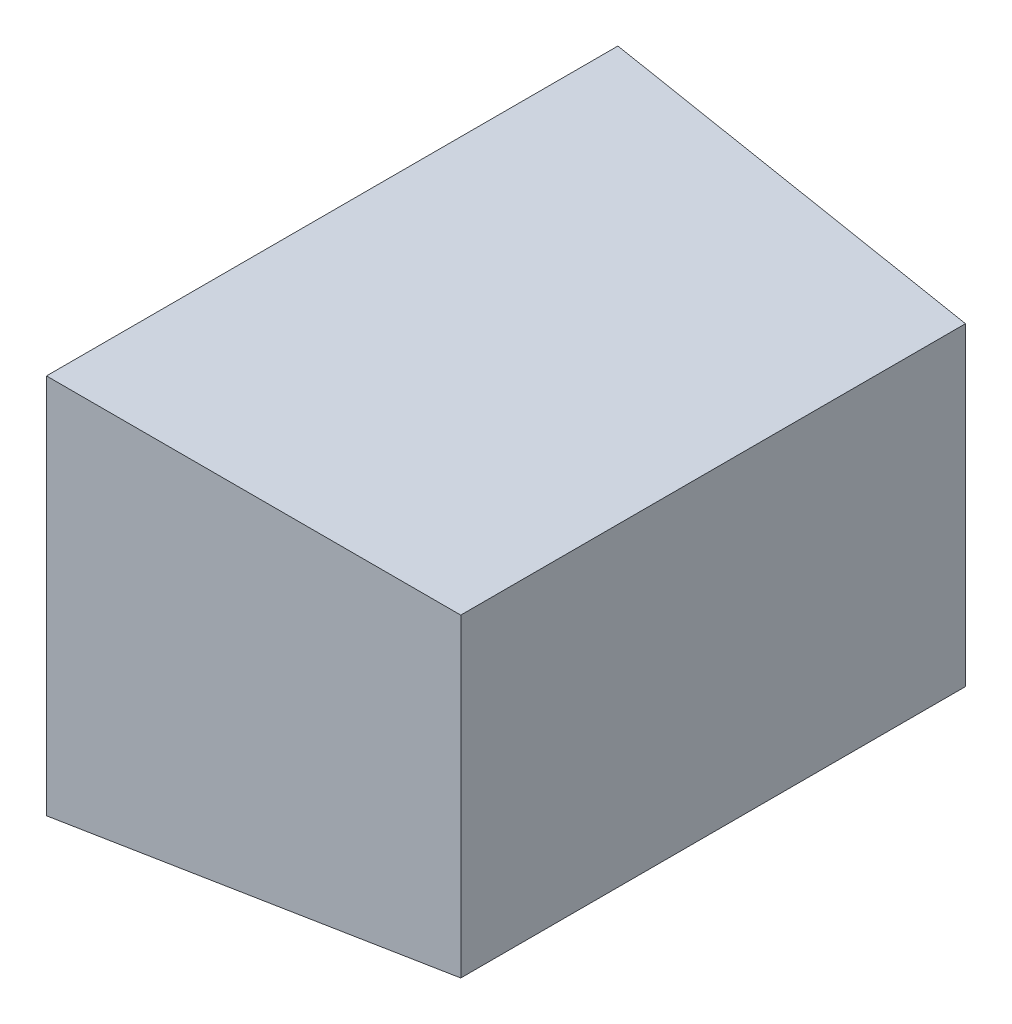
ISO-10303-21;
HEADER;
FILE_DESCRIPTION(('STEP AP214'),'2;1');
FILE_NAME('part.step','',(''),(''),'','','');
FILE_SCHEMA(('AUTOMOTIVE_DESIGN { 1 0 10303 214 1 1 1 1 }'));
ENDSEC;
DATA;
#1=APPLICATION_CONTEXT('core data for automotive mechanical design processes');
#2=APPLICATION_PROTOCOL_DEFINITION('international standard','automotive_design',2000,#1);
#3=PRODUCT_CONTEXT('',#1,'mechanical');
#4=PRODUCT('Part','Part','',(#3));
#5=PRODUCT_RELATED_PRODUCT_CATEGORY('part','',(#4));
#6=PRODUCT_DEFINITION_FORMATION('','',#4);
#7=PRODUCT_DEFINITION_CONTEXT('part definition',#1,'design');
#8=PRODUCT_DEFINITION('design','',#6,#7);
#9=PRODUCT_DEFINITION_SHAPE('','',#8);
#10=(LENGTH_UNIT() NAMED_UNIT(*) SI_UNIT(.MILLI.,.METRE.));
#11=(NAMED_UNIT(*) PLANE_ANGLE_UNIT() SI_UNIT($,.RADIAN.));
#12=(NAMED_UNIT(*) SI_UNIT($,.STERADIAN.) SOLID_ANGLE_UNIT());
#13=UNCERTAINTY_MEASURE_WITH_UNIT(LENGTH_MEASURE(1.E-05),#10,'distance_accuracy_value','');
#14=(GEOMETRIC_REPRESENTATION_CONTEXT(3) GLOBAL_UNCERTAINTY_ASSIGNED_CONTEXT((#13)) GLOBAL_UNIT_ASSIGNED_CONTEXT((#10,
#11,#12)) REPRESENTATION_CONTEXT('',''));
#15=CARTESIAN_POINT('',(0.,0.,0.));
#16=DIRECTION('',(0.,0.,1.));
#17=DIRECTION('',(1.,0.,0.));
#18=AXIS2_PLACEMENT_3D('',#15,#16,#17);
#19=CARTESIAN_POINT('',(0.,50.,-75.));
#20=DIRECTION('',(0.0871557427476584,0.,-0.996194698091746));
#21=DIRECTION('',(-0.996194698091746,0.,-0.0871557427476584));
#22=AXIS2_PLACEMENT_3D('',#19,#20,#21);
#23=PLANE('',#22);
#24=DIRECTION('',(0.,1.,0.));
#25=VECTOR('',#24,1.);
#26=CARTESIAN_POINT('',(0.,50.,-75.));
#27=LINE('',#26,#25);
#28=CARTESIAN_POINT('',(0.,-50.,-75.));
#29=VERTEX_POINT('',#28);
#30=CARTESIAN_POINT('',(0.,50.,-75.));
#31=VERTEX_POINT('',#30);
#32=EDGE_CURVE('E83',#29,#31,#27,.T.);
#33=ORIENTED_EDGE('',*,*,#32,.T.);
#34=DIRECTION('',(-0.992432509138967,0.0868265938642478,-0.0868265938642478));
#35=VECTOR('',#34,1.);
#36=CARTESIAN_POINT('',(12.9254301613028,48.8691713896899,-73.86917138969));
#37=LINE('',#36,#35);
#38=CARTESIAN_POINT('',(100.,41.2511336474076,-66.2511336474076));
#39=VERTEX_POINT('',#38);
#40=EDGE_CURVE('E11',#39,#31,#37,.T.);
#41=ORIENTED_EDGE('',*,*,#40,.F.);
#42=DIRECTION('',(0.,-1.,0.));
#43=VECTOR('',#42,1.);
#44=CARTESIAN_POINT('',(100.,50.,-66.2511336474076));
#45=LINE('',#44,#43);
#46=CARTESIAN_POINT('',(100.,-41.2511336474076,-66.2511336474076));
#47=VERTEX_POINT('',#46);
#48=EDGE_CURVE('E99',#47,#39,#45,.F.);
#49=ORIENTED_EDGE('',*,*,#48,.F.);
#50=DIRECTION('',(-0.992432509138967,-0.0868265938642478,-0.0868265938642478));
#51=VECTOR('',#50,1.);
#52=CARTESIAN_POINT('',(8.61695344086855,-49.2461142597933,-74.2461142597933));
#53=LINE('',#52,#51);
#54=EDGE_CURVE('E94',#47,#29,#53,.T.);
#55=ORIENTED_EDGE('',*,*,#54,.T.);
#56=EDGE_LOOP('',(#33,#41,#49,#55));
#57=FACE_BOUND('',#56,.T.);
#58=ADVANCED_FACE('F37',(#57),#23,.T.);
#59=CARTESIAN_POINT('',(0.,50.,75.));
#60=DIRECTION('',(0.0871557427476584,0.996194698091746,0.));
#61=DIRECTION('',(-0.996194698091746,0.0871557427476584,0.));
#62=AXIS2_PLACEMENT_3D('',#59,#60,#61);
#63=PLANE('',#62);
#64=DIRECTION('',(0.,0.,1.));
#65=VECTOR('',#64,1.);
#66=CARTESIAN_POINT('',(0.,50.,75.));
#67=LINE('',#66,#65);
#68=CARTESIAN_POINT('',(0.,50.,75.));
#69=VERTEX_POINT('',#68);
#70=EDGE_CURVE('E79',#31,#69,#67,.T.);
#71=ORIENTED_EDGE('',*,*,#70,.T.);
#72=DIRECTION('',(-0.992432509138967,0.0868265938642478,0.0868265938642478));
#73=VECTOR('',#72,1.);
#74=CARTESIAN_POINT('',(0.,50.,75.));
#75=LINE('',#74,#73);
#76=CARTESIAN_POINT('',(100.,41.2511336474076,66.2511336474076));
#77=VERTEX_POINT('',#76);
#78=EDGE_CURVE('E46',#77,#69,#75,.T.);
#79=ORIENTED_EDGE('',*,*,#78,.F.);
#80=DIRECTION('',(0.,0.,-1.));
#81=VECTOR('',#80,1.);
#82=CARTESIAN_POINT('',(100.,41.2511336474076,75.));
#83=LINE('',#82,#81);
#84=EDGE_CURVE('E90',#39,#77,#83,.F.);
#85=ORIENTED_EDGE('',*,*,#84,.F.);
#86=ORIENTED_EDGE('',*,*,#40,.T.);
#87=EDGE_LOOP('',(#71,#79,#85,#86));
#88=FACE_BOUND('',#87,.T.);
#89=ADVANCED_FACE('F39',(#88),#63,.T.);
#90=CARTESIAN_POINT('',(0.,50.,75.));
#91=DIRECTION('',(0.0871557427476584,0.,0.996194698091746));
#92=DIRECTION('',(0.996194698091746,0.,-0.0871557427476584));
#93=AXIS2_PLACEMENT_3D('',#90,#91,#92);
#94=PLANE('',#93);
#95=DIRECTION('',(0.,-1.,0.));
#96=VECTOR('',#95,1.);
#97=CARTESIAN_POINT('',(0.,50.,75.));
#98=LINE('',#97,#96);
#99=CARTESIAN_POINT('',(0.,-50.,75.));
#100=VERTEX_POINT('',#99);
#101=EDGE_CURVE('E84',#69,#100,#98,.T.);
#102=ORIENTED_EDGE('',*,*,#101,.T.);
#103=DIRECTION('',(-0.992432509138967,-0.0868265938642478,0.0868265938642478));
#104=VECTOR('',#103,1.);
#105=CARTESIAN_POINT('',(0.,-50.,75.));
#106=LINE('',#105,#104);
#107=CARTESIAN_POINT('',(100.,-41.2511336474076,66.2511336474075));
#108=VERTEX_POINT('',#107);
#109=EDGE_CURVE('E102',#108,#100,#106,.T.);
#110=ORIENTED_EDGE('',*,*,#109,.F.);
#111=DIRECTION('',(0.,1.,0.));
#112=VECTOR('',#111,1.);
#113=CARTESIAN_POINT('',(100.,50.,66.2511336474076));
#114=LINE('',#113,#112);
#115=EDGE_CURVE('E58',#77,#108,#114,.F.);
#116=ORIENTED_EDGE('',*,*,#115,.F.);
#117=ORIENTED_EDGE('',*,*,#78,.T.);
#118=EDGE_LOOP('',(#102,#110,#116,#117));
#119=FACE_BOUND('',#118,.T.);
#120=ADVANCED_FACE('F109',(#119),#94,.T.);
#121=CARTESIAN_POINT('',(0.,-50.,75.));
#122=DIRECTION('',(0.0871557427476584,-0.996194698091746,0.));
#123=DIRECTION('',(0.996194698091746,0.0871557427476584,0.));
#124=AXIS2_PLACEMENT_3D('',#121,#122,#123);
#125=PLANE('',#124);
#126=DIRECTION('',(0.,0.,-1.));
#127=VECTOR('',#126,1.);
#128=CARTESIAN_POINT('',(0.,-50.,75.));
#129=LINE('',#128,#127);
#130=EDGE_CURVE('E98',#100,#29,#129,.T.);
#131=ORIENTED_EDGE('',*,*,#130,.T.);
#132=ORIENTED_EDGE('',*,*,#54,.F.);
#133=DIRECTION('',(0.,0.,1.));
#134=VECTOR('',#133,1.);
#135=CARTESIAN_POINT('',(100.,-41.2511336474076,75.));
#136=LINE('',#135,#134);
#137=EDGE_CURVE('E41',#108,#47,#136,.F.);
#138=ORIENTED_EDGE('',*,*,#137,.F.);
#139=ORIENTED_EDGE('',*,*,#109,.T.);
#140=EDGE_LOOP('',(#131,#132,#138,#139));
#141=FACE_BOUND('',#140,.T.);
#142=ADVANCED_FACE('F111',(#141),#125,.T.);
#143=CARTESIAN_POINT('',(100.,0.,0.));
#144=DIRECTION('',(1.,0.,0.));
#145=DIRECTION('',(0.,0.,-1.));
#146=AXIS2_PLACEMENT_3D('',#143,#144,#145);
#147=PLANE('',#146);
#148=ORIENTED_EDGE('',*,*,#48,.T.);
#149=ORIENTED_EDGE('',*,*,#84,.T.);
#150=ORIENTED_EDGE('',*,*,#115,.T.);
#151=ORIENTED_EDGE('',*,*,#137,.T.);
#152=EDGE_LOOP('',(#148,#149,#150,#151));
#153=FACE_BOUND('',#152,.T.);
#154=ADVANCED_FACE('F107',(#153),#147,.T.);
#155=CARTESIAN_POINT('',(0.,0.,0.));
#156=DIRECTION('',(1.,0.,0.));
#157=DIRECTION('',(0.,0.,-1.));
#158=AXIS2_PLACEMENT_3D('',#155,#156,#157);
#159=PLANE('',#158);
#160=ORIENTED_EDGE('',*,*,#32,.F.);
#161=ORIENTED_EDGE('',*,*,#130,.F.);
#162=ORIENTED_EDGE('',*,*,#101,.F.);
#163=ORIENTED_EDGE('',*,*,#70,.F.);
#164=EDGE_LOOP('',(#160,#161,#162,#163));
#165=FACE_BOUND('',#164,.T.);
#166=ADVANCED_FACE('F80',(#165),#159,.F.);
#167=CLOSED_SHELL('',(#58,#89,#120,#142,#154,#166));
#168=MANIFOLD_SOLID_BREP('B2',#167);
#169=ADVANCED_BREP_SHAPE_REPRESENTATION('',(#18,#168),#14);
#170=SHAPE_DEFINITION_REPRESENTATION(#9,#169);
ENDSEC;
END-ISO-10303-21;
